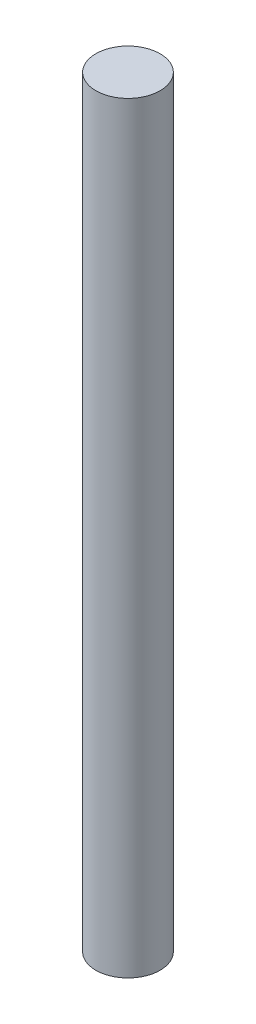
ISO-10303-21;
HEADER;
FILE_DESCRIPTION(('STEP AP214'),'2;1');
FILE_NAME('part.step','',(''),(''),'','','');
FILE_SCHEMA(('AUTOMOTIVE_DESIGN { 1 0 10303 214 1 1 1 1 }'));
ENDSEC;
DATA;
#1=APPLICATION_CONTEXT('core data for automotive mechanical design processes');
#2=APPLICATION_PROTOCOL_DEFINITION('international standard','automotive_design',2000,#1);
#3=PRODUCT_CONTEXT('',#1,'mechanical');
#4=PRODUCT('Part','Part','',(#3));
#5=PRODUCT_RELATED_PRODUCT_CATEGORY('part','',(#4));
#6=PRODUCT_DEFINITION_FORMATION('','',#4);
#7=PRODUCT_DEFINITION_CONTEXT('part definition',#1,'design');
#8=PRODUCT_DEFINITION('design','',#6,#7);
#9=PRODUCT_DEFINITION_SHAPE('','',#8);
#10=(LENGTH_UNIT() NAMED_UNIT(*) SI_UNIT(.MILLI.,.METRE.));
#11=(NAMED_UNIT(*) PLANE_ANGLE_UNIT() SI_UNIT($,.RADIAN.));
#12=(NAMED_UNIT(*) SI_UNIT($,.STERADIAN.) SOLID_ANGLE_UNIT());
#13=UNCERTAINTY_MEASURE_WITH_UNIT(LENGTH_MEASURE(1.E-05),#10,'distance_accuracy_value','');
#14=(GEOMETRIC_REPRESENTATION_CONTEXT(3) GLOBAL_UNCERTAINTY_ASSIGNED_CONTEXT((#13)) GLOBAL_UNIT_ASSIGNED_CONTEXT((#10,
#11,#12)) REPRESENTATION_CONTEXT('',''));
#15=CARTESIAN_POINT('',(0.,0.,0.));
#16=DIRECTION('',(0.,0.,1.));
#17=DIRECTION('',(1.,0.,0.));
#18=AXIS2_PLACEMENT_3D('',#15,#16,#17);
#19=CARTESIAN_POINT('',(0.,35.6,0.));
#20=DIRECTION('',(0.,-1.,0.));
#21=DIRECTION('',(0.,0.,-1.));
#22=AXIS2_PLACEMENT_3D('',#19,#20,#21);
#23=CYLINDRICAL_SURFACE('',#22,1.5);
#24=CARTESIAN_POINT('',(0.,35.6,0.));
#25=DIRECTION('',(0.,1.,0.));
#26=DIRECTION('',(0.,0.,1.));
#27=AXIS2_PLACEMENT_3D('',#24,#25,#26);
#28=CIRCLE('',#27,1.5);
#29=CARTESIAN_POINT('',(0.,35.6,1.5));
#30=VERTEX_POINT('',#29);
#31=EDGE_CURVE('E10',#30,#30,#28,.T.);
#32=ORIENTED_EDGE('',*,*,#31,.F.);
#33=EDGE_LOOP('',(#32));
#34=FACE_BOUND('',#33,.T.);
#35=CARTESIAN_POINT('',(0.,0.,0.));
#36=DIRECTION('',(0.,1.,0.));
#37=DIRECTION('',(0.,0.,1.));
#38=AXIS2_PLACEMENT_3D('',#35,#36,#37);
#39=CIRCLE('',#38,1.5);
#40=CARTESIAN_POINT('',(0.,0.,1.5));
#41=VERTEX_POINT('',#40);
#42=EDGE_CURVE('E40',#41,#41,#39,.T.);
#43=ORIENTED_EDGE('',*,*,#42,.T.);
#44=EDGE_LOOP('',(#43));
#45=FACE_BOUND('',#44,.T.);
#46=ADVANCED_FACE('F37',(#34,#45),#23,.T.);
#47=CARTESIAN_POINT('',(0.,35.6,0.));
#48=DIRECTION('',(0.,1.,0.));
#49=DIRECTION('',(0.,0.,1.));
#50=AXIS2_PLACEMENT_3D('',#47,#48,#49);
#51=PLANE('',#50);
#52=ORIENTED_EDGE('',*,*,#31,.T.);
#53=EDGE_LOOP('',(#52));
#54=FACE_BOUND('',#53,.T.);
#55=ADVANCED_FACE('F52',(#54),#51,.T.);
#56=CARTESIAN_POINT('',(0.,0.,0.));
#57=DIRECTION('',(0.,1.,0.));
#58=DIRECTION('',(0.,0.,1.));
#59=AXIS2_PLACEMENT_3D('',#56,#57,#58);
#60=PLANE('',#59);
#61=ORIENTED_EDGE('',*,*,#42,.F.);
#62=EDGE_LOOP('',(#61));
#63=FACE_BOUND('',#62,.T.);
#64=ADVANCED_FACE('F50',(#63),#60,.F.);
#65=CLOSED_SHELL('',(#46,#55,#64));
#66=MANIFOLD_SOLID_BREP('B2',#65);
#67=ADVANCED_BREP_SHAPE_REPRESENTATION('',(#18,#66),#14);
#68=SHAPE_DEFINITION_REPRESENTATION(#9,#67);
ENDSEC;
END-ISO-10303-21;
